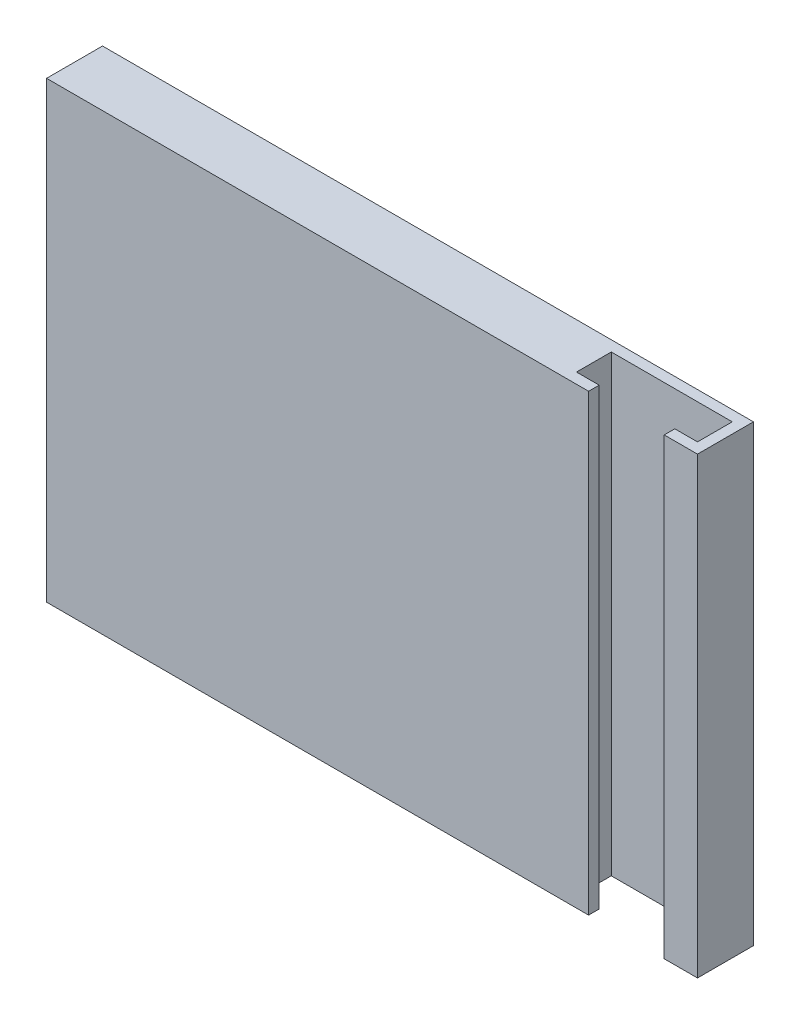
ISO-10303-21;
HEADER;
FILE_DESCRIPTION(('STEP AP214'),'2;1');
FILE_NAME('part.step','',(''),(''),'','','');
FILE_SCHEMA(('AUTOMOTIVE_DESIGN { 1 0 10303 214 1 1 1 1 }'));
ENDSEC;
DATA;
#1=APPLICATION_CONTEXT('core data for automotive mechanical design processes');
#2=APPLICATION_PROTOCOL_DEFINITION('international standard','automotive_design',2000,#1);
#3=PRODUCT_CONTEXT('',#1,'mechanical');
#4=PRODUCT('Part','Part','',(#3));
#5=PRODUCT_RELATED_PRODUCT_CATEGORY('part','',(#4));
#6=PRODUCT_DEFINITION_FORMATION('','',#4);
#7=PRODUCT_DEFINITION_CONTEXT('part definition',#1,'design');
#8=PRODUCT_DEFINITION('design','',#6,#7);
#9=PRODUCT_DEFINITION_SHAPE('','',#8);
#10=(LENGTH_UNIT() NAMED_UNIT(*) SI_UNIT(.MILLI.,.METRE.));
#11=(NAMED_UNIT(*) PLANE_ANGLE_UNIT() SI_UNIT($,.RADIAN.));
#12=(NAMED_UNIT(*) SI_UNIT($,.STERADIAN.) SOLID_ANGLE_UNIT());
#13=UNCERTAINTY_MEASURE_WITH_UNIT(LENGTH_MEASURE(1.E-05),#10,'distance_accuracy_value','');
#14=(GEOMETRIC_REPRESENTATION_CONTEXT(3) GLOBAL_UNCERTAINTY_ASSIGNED_CONTEXT((#13)) GLOBAL_UNIT_ASSIGNED_CONTEXT((#10,
#11,#12)) REPRESENTATION_CONTEXT('',''));
#15=CARTESIAN_POINT('',(0.,0.,0.));
#16=DIRECTION('',(0.,0.,1.));
#17=DIRECTION('',(1.,0.,0.));
#18=AXIS2_PLACEMENT_3D('',#15,#16,#17);
#19=CARTESIAN_POINT('',(131.503336752645,150.,-178.212463787393));
#20=DIRECTION('',(1.,0.,0.));
#21=DIRECTION('',(0.,0.,-1.));
#22=AXIS2_PLACEMENT_3D('',#19,#20,#21);
#23=PLANE('',#22);
#24=DIRECTION('',(0.,0.,1.));
#25=VECTOR('',#24,1.);
#26=CARTESIAN_POINT('',(131.503336752645,-150.,-178.212463787393));
#27=LINE('',#26,#25);
#28=CARTESIAN_POINT('',(131.503336752645,-150.,-178.212463787393));
#29=VERTEX_POINT('',#28);
#30=CARTESIAN_POINT('',(131.503336752645,-150.,-171.212463787393));
#31=VERTEX_POINT('',#30);
#32=EDGE_CURVE('E147',#29,#31,#27,.T.);
#33=ORIENTED_EDGE('',*,*,#32,.T.);
#34=DIRECTION('',(0.,-1.,0.));
#35=VECTOR('',#34,1.);
#36=CARTESIAN_POINT('',(131.503336752645,150.,-171.212463787393));
#37=LINE('',#36,#35);
#38=CARTESIAN_POINT('',(131.503336752645,150.,-171.212463787393));
#39=VERTEX_POINT('',#38);
#40=EDGE_CURVE('E11',#39,#31,#37,.T.);
#41=ORIENTED_EDGE('',*,*,#40,.F.);
#42=DIRECTION('',(0.,0.,1.));
#43=VECTOR('',#42,1.);
#44=CARTESIAN_POINT('',(131.503336752645,150.,-178.212463787393));
#45=LINE('',#44,#43);
#46=CARTESIAN_POINT('',(131.503336752645,150.,-178.212463787393));
#47=VERTEX_POINT('',#46);
#48=EDGE_CURVE('E172',#47,#39,#45,.T.);
#49=ORIENTED_EDGE('',*,*,#48,.F.);
#50=DIRECTION('',(0.,-1.,0.));
#51=VECTOR('',#50,1.);
#52=CARTESIAN_POINT('',(131.503336752645,150.,-178.212463787393));
#53=LINE('',#52,#51);
#54=EDGE_CURVE('E148',#47,#29,#53,.T.);
#55=ORIENTED_EDGE('',*,*,#54,.T.);
#56=EDGE_LOOP('',(#33,#41,#49,#55));
#57=FACE_BOUND('',#56,.T.);
#58=ADVANCED_FACE('F39',(#57),#23,.F.);
#59=CARTESIAN_POINT('',(131.503336752645,150.,-171.212463787393));
#60=DIRECTION('',(0.,0.,-1.));
#61=DIRECTION('',(-1.,0.,0.));
#62=AXIS2_PLACEMENT_3D('',#59,#60,#61);
#63=PLANE('',#62);
#64=DIRECTION('',(1.,0.,0.));
#65=VECTOR('',#64,1.);
#66=CARTESIAN_POINT('',(131.503336752645,-150.,-171.212463787393));
#67=LINE('',#66,#65);
#68=CARTESIAN_POINT('',(153.503336752645,-150.,-171.212463787393));
#69=VERTEX_POINT('',#68);
#70=EDGE_CURVE('E153',#31,#69,#67,.T.);
#71=ORIENTED_EDGE('',*,*,#70,.T.);
#72=DIRECTION('',(0.,-1.,0.));
#73=VECTOR('',#72,1.);
#74=CARTESIAN_POINT('',(153.503336752645,150.,-171.212463787393));
#75=LINE('',#74,#73);
#76=CARTESIAN_POINT('',(153.503336752645,150.,-171.212463787393));
#77=VERTEX_POINT('',#76);
#78=EDGE_CURVE('E50',#77,#69,#75,.T.);
#79=ORIENTED_EDGE('',*,*,#78,.F.);
#80=DIRECTION('',(1.,0.,0.));
#81=VECTOR('',#80,1.);
#82=CARTESIAN_POINT('',(131.503336752645,150.,-171.212463787393));
#83=LINE('',#82,#81);
#84=EDGE_CURVE('E104',#39,#77,#83,.T.);
#85=ORIENTED_EDGE('',*,*,#84,.F.);
#86=ORIENTED_EDGE('',*,*,#40,.T.);
#87=EDGE_LOOP('',(#71,#79,#85,#86));
#88=FACE_BOUND('',#87,.T.);
#89=ADVANCED_FACE('F264',(#88),#63,.F.);
#90=CARTESIAN_POINT('',(153.503336752645,150.,-171.212463787393));
#91=DIRECTION('',(-1.,0.,0.));
#92=DIRECTION('',(0.,0.,1.));
#93=AXIS2_PLACEMENT_3D('',#90,#91,#92);
#94=PLANE('',#93);
#95=DIRECTION('',(0.,0.,-1.));
#96=VECTOR('',#95,1.);
#97=CARTESIAN_POINT('',(153.503336752645,-150.,-171.212463787393));
#98=LINE('',#97,#96);
#99=CARTESIAN_POINT('',(153.503336752645,-150.,-208.212463787393));
#100=VERTEX_POINT('',#99);
#101=EDGE_CURVE('E156',#69,#100,#98,.T.);
#102=ORIENTED_EDGE('',*,*,#101,.T.);
#103=DIRECTION('',(0.,-1.,0.));
#104=VECTOR('',#103,1.);
#105=CARTESIAN_POINT('',(153.503336752645,150.,-208.212463787393));
#106=LINE('',#105,#104);
#107=CARTESIAN_POINT('',(153.503336752645,150.,-208.212463787393));
#108=VERTEX_POINT('',#107);
#109=EDGE_CURVE('E183',#108,#100,#106,.T.);
#110=ORIENTED_EDGE('',*,*,#109,.F.);
#111=DIRECTION('',(0.,0.,-1.));
#112=VECTOR('',#111,1.);
#113=CARTESIAN_POINT('',(153.503336752645,150.,-171.212463787393));
#114=LINE('',#113,#112);
#115=EDGE_CURVE('E192',#77,#108,#114,.T.);
#116=ORIENTED_EDGE('',*,*,#115,.F.);
#117=ORIENTED_EDGE('',*,*,#78,.T.);
#118=EDGE_LOOP('',(#102,#110,#116,#117));
#119=FACE_BOUND('',#118,.T.);
#120=ADVANCED_FACE('F193',(#119),#94,.F.);
#121=CARTESIAN_POINT('',(153.503336752645,150.,-208.212463787393));
#122=DIRECTION('',(0.,0.,1.));
#123=DIRECTION('',(1.,0.,0.));
#124=AXIS2_PLACEMENT_3D('',#121,#122,#123);
#125=PLANE('',#124);
#126=DIRECTION('',(-1.,0.,0.));
#127=VECTOR('',#126,1.);
#128=CARTESIAN_POINT('',(153.503336752645,-150.,-208.212463787393));
#129=LINE('',#128,#127);
#130=CARTESIAN_POINT('',(-276.919397430476,-150.,-208.212463787393));
#131=VERTEX_POINT('',#130);
#132=EDGE_CURVE('E158',#100,#131,#129,.T.);
#133=ORIENTED_EDGE('',*,*,#132,.T.);
#134=DIRECTION('',(0.,1.,0.));
#135=VECTOR('',#134,1.);
#136=CARTESIAN_POINT('',(-276.919397430476,150.,-208.212463787393));
#137=LINE('',#136,#135);
#138=CARTESIAN_POINT('',(-276.919397430476,150.,-208.212463787393));
#139=VERTEX_POINT('',#138);
#140=EDGE_CURVE('E152',#131,#139,#137,.T.);
#141=ORIENTED_EDGE('',*,*,#140,.T.);
#142=DIRECTION('',(-1.,0.,0.));
#143=VECTOR('',#142,1.);
#144=CARTESIAN_POINT('',(153.503336752645,150.,-208.212463787393));
#145=LINE('',#144,#143);
#146=EDGE_CURVE('E223',#108,#139,#145,.T.);
#147=ORIENTED_EDGE('',*,*,#146,.F.);
#148=ORIENTED_EDGE('',*,*,#109,.T.);
#149=EDGE_LOOP('',(#133,#141,#147,#148));
#150=FACE_BOUND('',#149,.T.);
#151=ADVANCED_FACE('F206',(#150),#125,.F.);
#152=CARTESIAN_POINT('',(59.5033367526454,150.,-171.212463787393));
#153=DIRECTION('',(0.,0.,-1.));
#154=DIRECTION('',(-1.,0.,0.));
#155=AXIS2_PLACEMENT_3D('',#152,#153,#154);
#156=PLANE('',#155);
#157=DIRECTION('',(1.,0.,0.));
#158=VECTOR('',#157,1.);
#159=CARTESIAN_POINT('',(59.5033367526454,-150.,-171.212463787393));
#160=LINE('',#159,#158);
#161=CARTESIAN_POINT('',(-276.919397430476,-150.,-171.212463787393));
#162=VERTEX_POINT('',#161);
#163=CARTESIAN_POINT('',(81.5033367526455,-150.,-171.212463787393));
#164=VERTEX_POINT('',#163);
#165=EDGE_CURVE('E161',#162,#164,#160,.T.);
#166=ORIENTED_EDGE('',*,*,#165,.T.);
#167=DIRECTION('',(0.,-1.,0.));
#168=VECTOR('',#167,1.);
#169=CARTESIAN_POINT('',(81.5033367526455,150.,-171.212463787393));
#170=LINE('',#169,#168);
#171=CARTESIAN_POINT('',(81.5033367526455,150.,-171.212463787393));
#172=VERTEX_POINT('',#171);
#173=EDGE_CURVE('E185',#172,#164,#170,.T.);
#174=ORIENTED_EDGE('',*,*,#173,.F.);
#175=DIRECTION('',(1.,0.,0.));
#176=VECTOR('',#175,1.);
#177=CARTESIAN_POINT('',(59.5033367526454,150.,-171.212463787393));
#178=LINE('',#177,#176);
#179=CARTESIAN_POINT('',(-276.919397430476,150.,-171.212463787393));
#180=VERTEX_POINT('',#179);
#181=EDGE_CURVE('E217',#180,#172,#178,.T.);
#182=ORIENTED_EDGE('',*,*,#181,.F.);
#183=DIRECTION('',(0.,-1.,0.));
#184=VECTOR('',#183,1.);
#185=CARTESIAN_POINT('',(-276.919397430476,150.,-171.212463787393));
#186=LINE('',#185,#184);
#187=EDGE_CURVE('E225',#180,#162,#186,.T.);
#188=ORIENTED_EDGE('',*,*,#187,.T.);
#189=EDGE_LOOP('',(#166,#174,#182,#188));
#190=FACE_BOUND('',#189,.T.);
#191=ADVANCED_FACE('F219',(#190),#156,.F.);
#192=CARTESIAN_POINT('',(81.5033367526455,150.,-178.212463787393));
#193=DIRECTION('',(-1.,0.,0.));
#194=DIRECTION('',(0.,0.,1.));
#195=AXIS2_PLACEMENT_3D('',#192,#193,#194);
#196=PLANE('',#195);
#197=DIRECTION('',(0.,0.,-1.));
#198=VECTOR('',#197,1.);
#199=CARTESIAN_POINT('',(81.5033367526455,-150.,-178.212463787393));
#200=LINE('',#199,#198);
#201=CARTESIAN_POINT('',(81.5033367526455,-150.,-178.212463787393));
#202=VERTEX_POINT('',#201);
#203=EDGE_CURVE('E162',#164,#202,#200,.T.);
#204=ORIENTED_EDGE('',*,*,#203,.T.);
#205=DIRECTION('',(0.,-1.,0.));
#206=VECTOR('',#205,1.);
#207=CARTESIAN_POINT('',(81.5033367526455,150.,-178.212463787393));
#208=LINE('',#207,#206);
#209=CARTESIAN_POINT('',(81.5033367526455,150.,-178.212463787393));
#210=VERTEX_POINT('',#209);
#211=EDGE_CURVE('E180',#210,#202,#208,.T.);
#212=ORIENTED_EDGE('',*,*,#211,.F.);
#213=DIRECTION('',(0.,0.,-1.));
#214=VECTOR('',#213,1.);
#215=CARTESIAN_POINT('',(81.5033367526455,150.,-178.212463787393));
#216=LINE('',#215,#214);
#217=EDGE_CURVE('E221',#172,#210,#216,.T.);
#218=ORIENTED_EDGE('',*,*,#217,.F.);
#219=ORIENTED_EDGE('',*,*,#173,.T.);
#220=EDGE_LOOP('',(#204,#212,#218,#219));
#221=FACE_BOUND('',#220,.T.);
#222=ADVANCED_FACE('F280',(#221),#196,.F.);
#223=CARTESIAN_POINT('',(66.5033367526454,150.,-178.212463787393));
#224=DIRECTION('',(0.,0.,1.));
#225=DIRECTION('',(1.,0.,0.));
#226=AXIS2_PLACEMENT_3D('',#223,#224,#225);
#227=PLANE('',#226);
#228=DIRECTION('',(-1.,0.,0.));
#229=VECTOR('',#228,1.);
#230=CARTESIAN_POINT('',(66.5033367526454,-150.,-178.212463787393));
#231=LINE('',#230,#229);
#232=CARTESIAN_POINT('',(66.5033367526454,-150.,-178.212463787393));
#233=VERTEX_POINT('',#232);
#234=EDGE_CURVE('E164',#202,#233,#231,.T.);
#235=ORIENTED_EDGE('',*,*,#234,.T.);
#236=DIRECTION('',(0.,-1.,0.));
#237=VECTOR('',#236,1.);
#238=CARTESIAN_POINT('',(66.5033367526454,150.,-178.212463787393));
#239=LINE('',#238,#237);
#240=CARTESIAN_POINT('',(66.5033367526454,150.,-178.212463787393));
#241=VERTEX_POINT('',#240);
#242=EDGE_CURVE('E178',#241,#233,#239,.T.);
#243=ORIENTED_EDGE('',*,*,#242,.F.);
#244=DIRECTION('',(-1.,0.,0.));
#245=VECTOR('',#244,1.);
#246=CARTESIAN_POINT('',(66.5033367526454,150.,-178.212463787393));
#247=LINE('',#246,#245);
#248=EDGE_CURVE('E238',#210,#241,#247,.T.);
#249=ORIENTED_EDGE('',*,*,#248,.F.);
#250=ORIENTED_EDGE('',*,*,#211,.T.);
#251=EDGE_LOOP('',(#235,#243,#249,#250));
#252=FACE_BOUND('',#251,.T.);
#253=ADVANCED_FACE('F245',(#252),#227,.F.);
#254=CARTESIAN_POINT('',(66.5033367526454,150.,-201.212463787393));
#255=DIRECTION('',(-1.,0.,0.));
#256=DIRECTION('',(0.,0.,1.));
#257=AXIS2_PLACEMENT_3D('',#254,#255,#256);
#258=PLANE('',#257);
#259=DIRECTION('',(0.,0.,-1.));
#260=VECTOR('',#259,1.);
#261=CARTESIAN_POINT('',(66.5033367526454,-150.,-201.212463787393));
#262=LINE('',#261,#260);
#263=CARTESIAN_POINT('',(66.5033367526454,-150.,-201.212463787393));
#264=VERTEX_POINT('',#263);
#265=EDGE_CURVE('E170',#233,#264,#262,.T.);
#266=ORIENTED_EDGE('',*,*,#265,.T.);
#267=DIRECTION('',(0.,-1.,0.));
#268=VECTOR('',#267,1.);
#269=CARTESIAN_POINT('',(66.5033367526454,150.,-201.212463787393));
#270=LINE('',#269,#268);
#271=CARTESIAN_POINT('',(66.5033367526454,150.,-201.212463787393));
#272=VERTEX_POINT('',#271);
#273=EDGE_CURVE('E143',#272,#264,#270,.T.);
#274=ORIENTED_EDGE('',*,*,#273,.F.);
#275=DIRECTION('',(0.,0.,-1.));
#276=VECTOR('',#275,1.);
#277=CARTESIAN_POINT('',(66.5033367526454,150.,-201.212463787393));
#278=LINE('',#277,#276);
#279=EDGE_CURVE('E132',#241,#272,#278,.T.);
#280=ORIENTED_EDGE('',*,*,#279,.F.);
#281=ORIENTED_EDGE('',*,*,#242,.T.);
#282=EDGE_LOOP('',(#266,#274,#280,#281));
#283=FACE_BOUND('',#282,.T.);
#284=ADVANCED_FACE('F250',(#283),#258,.F.);
#285=CARTESIAN_POINT('',(146.503336752645,150.,-201.212463787393));
#286=DIRECTION('',(0.,0.,-1.));
#287=DIRECTION('',(-1.,0.,0.));
#288=AXIS2_PLACEMENT_3D('',#285,#286,#287);
#289=PLANE('',#288);
#290=DIRECTION('',(1.,0.,0.));
#291=VECTOR('',#290,1.);
#292=CARTESIAN_POINT('',(146.503336752645,-150.,-201.212463787393));
#293=LINE('',#292,#291);
#294=CARTESIAN_POINT('',(146.503336752645,-150.,-201.212463787393));
#295=VERTEX_POINT('',#294);
#296=EDGE_CURVE('E136',#264,#295,#293,.T.);
#297=ORIENTED_EDGE('',*,*,#296,.T.);
#298=DIRECTION('',(0.,-1.,0.));
#299=VECTOR('',#298,1.);
#300=CARTESIAN_POINT('',(146.503336752645,150.,-201.212463787393));
#301=LINE('',#300,#299);
#302=CARTESIAN_POINT('',(146.503336752645,150.,-201.212463787393));
#303=VERTEX_POINT('',#302);
#304=EDGE_CURVE('E139',#303,#295,#301,.T.);
#305=ORIENTED_EDGE('',*,*,#304,.F.);
#306=DIRECTION('',(1.,0.,0.));
#307=VECTOR('',#306,1.);
#308=CARTESIAN_POINT('',(146.503336752645,150.,-201.212463787393));
#309=LINE('',#308,#307);
#310=EDGE_CURVE('E127',#272,#303,#309,.T.);
#311=ORIENTED_EDGE('',*,*,#310,.F.);
#312=ORIENTED_EDGE('',*,*,#273,.T.);
#313=EDGE_LOOP('',(#297,#305,#311,#312));
#314=FACE_BOUND('',#313,.T.);
#315=ADVANCED_FACE('F137',(#314),#289,.F.);
#316=CARTESIAN_POINT('',(146.503336752645,150.,-178.212463787393));
#317=DIRECTION('',(1.,0.,0.));
#318=DIRECTION('',(0.,0.,-1.));
#319=AXIS2_PLACEMENT_3D('',#316,#317,#318);
#320=PLANE('',#319);
#321=DIRECTION('',(0.,0.,1.));
#322=VECTOR('',#321,1.);
#323=CARTESIAN_POINT('',(146.503336752645,-150.,-178.212463787393));
#324=LINE('',#323,#322);
#325=CARTESIAN_POINT('',(146.503336752645,-150.,-178.212463787393));
#326=VERTEX_POINT('',#325);
#327=EDGE_CURVE('E93',#295,#326,#324,.T.);
#328=ORIENTED_EDGE('',*,*,#327,.T.);
#329=DIRECTION('',(0.,-1.,0.));
#330=VECTOR('',#329,1.);
#331=CARTESIAN_POINT('',(146.503336752645,150.,-178.212463787393));
#332=LINE('',#331,#330);
#333=CARTESIAN_POINT('',(146.503336752645,150.,-178.212463787393));
#334=VERTEX_POINT('',#333);
#335=EDGE_CURVE('E142',#334,#326,#332,.T.);
#336=ORIENTED_EDGE('',*,*,#335,.F.);
#337=DIRECTION('',(0.,0.,1.));
#338=VECTOR('',#337,1.);
#339=CARTESIAN_POINT('',(146.503336752645,150.,-178.212463787393));
#340=LINE('',#339,#338);
#341=EDGE_CURVE('E128',#303,#334,#340,.T.);
#342=ORIENTED_EDGE('',*,*,#341,.F.);
#343=ORIENTED_EDGE('',*,*,#304,.T.);
#344=EDGE_LOOP('',(#328,#336,#342,#343));
#345=FACE_BOUND('',#344,.T.);
#346=ADVANCED_FACE('F145',(#345),#320,.F.);
#347=CARTESIAN_POINT('',(131.503336752645,150.,-178.212463787393));
#348=DIRECTION('',(0.,0.,1.));
#349=DIRECTION('',(1.,0.,0.));
#350=AXIS2_PLACEMENT_3D('',#347,#348,#349);
#351=PLANE('',#350);
#352=DIRECTION('',(-1.,0.,0.));
#353=VECTOR('',#352,1.);
#354=CARTESIAN_POINT('',(131.503336752645,-150.,-178.212463787393));
#355=LINE('',#354,#353);
#356=EDGE_CURVE('E100',#326,#29,#355,.T.);
#357=ORIENTED_EDGE('',*,*,#356,.T.);
#358=ORIENTED_EDGE('',*,*,#54,.F.);
#359=DIRECTION('',(-1.,0.,0.));
#360=VECTOR('',#359,1.);
#361=CARTESIAN_POINT('',(131.503336752645,150.,-178.212463787393));
#362=LINE('',#361,#360);
#363=EDGE_CURVE('E54',#334,#47,#362,.T.);
#364=ORIENTED_EDGE('',*,*,#363,.F.);
#365=ORIENTED_EDGE('',*,*,#335,.T.);
#366=EDGE_LOOP('',(#357,#358,#364,#365));
#367=FACE_BOUND('',#366,.T.);
#368=ADVANCED_FACE('F251',(#367),#351,.F.);
#369=CARTESIAN_POINT('',(0.,150.,0.));
#370=DIRECTION('',(0.,1.,0.));
#371=DIRECTION('',(0.,0.,1.));
#372=AXIS2_PLACEMENT_3D('',#369,#370,#371);
#373=PLANE('',#372);
#374=ORIENTED_EDGE('',*,*,#48,.T.);
#375=ORIENTED_EDGE('',*,*,#84,.T.);
#376=ORIENTED_EDGE('',*,*,#115,.T.);
#377=ORIENTED_EDGE('',*,*,#146,.T.);
#378=DIRECTION('',(0.,0.,1.));
#379=VECTOR('',#378,1.);
#380=CARTESIAN_POINT('',(-276.919397430476,150.,-658.96767016359));
#381=LINE('',#380,#379);
#382=EDGE_CURVE('E227',#139,#180,#381,.T.);
#383=ORIENTED_EDGE('',*,*,#382,.T.);
#384=ORIENTED_EDGE('',*,*,#181,.T.);
#385=ORIENTED_EDGE('',*,*,#217,.T.);
#386=ORIENTED_EDGE('',*,*,#248,.T.);
#387=ORIENTED_EDGE('',*,*,#279,.T.);
#388=ORIENTED_EDGE('',*,*,#310,.T.);
#389=ORIENTED_EDGE('',*,*,#341,.T.);
#390=ORIENTED_EDGE('',*,*,#363,.T.);
#391=EDGE_LOOP('',(#374,#375,#376,#377,#383,#384,#385,#386,#387,#388,#389,#390));
#392=FACE_BOUND('',#391,.T.);
#393=ADVANCED_FACE('F126',(#392),#373,.T.);
#394=CARTESIAN_POINT('',(0.,-150.,0.));
#395=DIRECTION('',(0.,1.,0.));
#396=DIRECTION('',(0.,0.,1.));
#397=AXIS2_PLACEMENT_3D('',#394,#395,#396);
#398=PLANE('',#397);
#399=ORIENTED_EDGE('',*,*,#32,.F.);
#400=ORIENTED_EDGE('',*,*,#356,.F.);
#401=ORIENTED_EDGE('',*,*,#327,.F.);
#402=ORIENTED_EDGE('',*,*,#296,.F.);
#403=ORIENTED_EDGE('',*,*,#265,.F.);
#404=ORIENTED_EDGE('',*,*,#234,.F.);
#405=ORIENTED_EDGE('',*,*,#203,.F.);
#406=ORIENTED_EDGE('',*,*,#165,.F.);
#407=DIRECTION('',(0.,0.,1.));
#408=VECTOR('',#407,1.);
#409=CARTESIAN_POINT('',(-276.919397430476,-150.,-658.96767016359));
#410=LINE('',#409,#408);
#411=EDGE_CURVE('E205',#131,#162,#410,.T.);
#412=ORIENTED_EDGE('',*,*,#411,.F.);
#413=ORIENTED_EDGE('',*,*,#132,.F.);
#414=ORIENTED_EDGE('',*,*,#101,.F.);
#415=ORIENTED_EDGE('',*,*,#70,.F.);
#416=EDGE_LOOP('',(#399,#400,#401,#402,#403,#404,#405,#406,#412,#413,#414,#415));
#417=FACE_BOUND('',#416,.T.);
#418=ADVANCED_FACE('F197',(#417),#398,.F.);
#419=CARTESIAN_POINT('',(-276.919397430476,150.,-658.96767016359));
#420=DIRECTION('',(-1.,0.,0.));
#421=DIRECTION('',(0.,0.,1.));
#422=AXIS2_PLACEMENT_3D('',#419,#420,#421);
#423=PLANE('',#422);
#424=ORIENTED_EDGE('',*,*,#140,.F.);
#425=ORIENTED_EDGE('',*,*,#411,.T.);
#426=ORIENTED_EDGE('',*,*,#187,.F.);
#427=ORIENTED_EDGE('',*,*,#382,.F.);
#428=EDGE_LOOP('',(#424,#425,#426,#427));
#429=FACE_BOUND('',#428,.T.);
#430=ADVANCED_FACE('F230',(#429),#423,.T.);
#431=CLOSED_SHELL('',(#58,#89,#120,#151,#191,#222,#253,#284,#315,#346,#368,#393,#418,#430));
#432=MANIFOLD_SOLID_BREP('B2',#431);
#433=ADVANCED_BREP_SHAPE_REPRESENTATION('',(#18,#432),#14);
#434=SHAPE_DEFINITION_REPRESENTATION(#9,#433);
ENDSEC;
END-ISO-10303-21;
